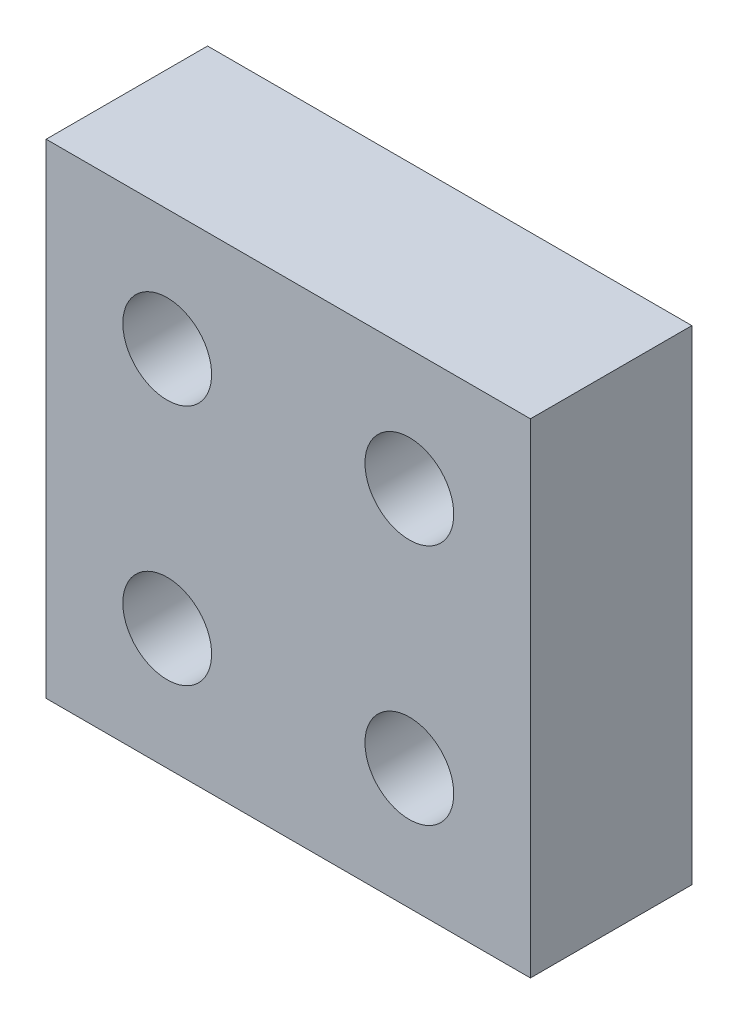
ISO-10303-21;
HEADER;
FILE_DESCRIPTION(('STEP AP214'),'2;1');
FILE_NAME('part.step','',(''),(''),'','','');
FILE_SCHEMA(('AUTOMOTIVE_DESIGN { 1 0 10303 214 1 1 1 1 }'));
ENDSEC;
DATA;
#1=APPLICATION_CONTEXT('core data for automotive mechanical design processes');
#2=APPLICATION_PROTOCOL_DEFINITION('international standard','automotive_design',2000,#1);
#3=PRODUCT_CONTEXT('',#1,'mechanical');
#4=PRODUCT('Part','Part','',(#3));
#5=PRODUCT_RELATED_PRODUCT_CATEGORY('part','',(#4));
#6=PRODUCT_DEFINITION_FORMATION('','',#4);
#7=PRODUCT_DEFINITION_CONTEXT('part definition',#1,'design');
#8=PRODUCT_DEFINITION('design','',#6,#7);
#9=PRODUCT_DEFINITION_SHAPE('','',#8);
#10=(LENGTH_UNIT() NAMED_UNIT(*) SI_UNIT(.MILLI.,.METRE.));
#11=(NAMED_UNIT(*) PLANE_ANGLE_UNIT() SI_UNIT($,.RADIAN.));
#12=(NAMED_UNIT(*) SI_UNIT($,.STERADIAN.) SOLID_ANGLE_UNIT());
#13=UNCERTAINTY_MEASURE_WITH_UNIT(LENGTH_MEASURE(1.E-05),#10,'distance_accuracy_value','');
#14=(GEOMETRIC_REPRESENTATION_CONTEXT(3) GLOBAL_UNCERTAINTY_ASSIGNED_CONTEXT((#13)) GLOBAL_UNIT_ASSIGNED_CONTEXT((#10,
#11,#12)) REPRESENTATION_CONTEXT('',''));
#15=CARTESIAN_POINT('',(0.,0.,0.));
#16=DIRECTION('',(0.,0.,1.));
#17=DIRECTION('',(1.,0.,0.));
#18=AXIS2_PLACEMENT_3D('',#15,#16,#17);
#19=CARTESIAN_POINT('',(12.,12.,0.));
#20=DIRECTION('',(0.,1.,0.));
#21=DIRECTION('',(-1.,0.,0.));
#22=AXIS2_PLACEMENT_3D('',#19,#20,#21);
#23=PLANE('',#22);
#24=DIRECTION('',(-1.,0.,0.));
#25=VECTOR('',#24,1.);
#26=CARTESIAN_POINT('',(12.,12.,8.));
#27=LINE('',#26,#25);
#28=CARTESIAN_POINT('',(12.,12.,8.));
#29=VERTEX_POINT('',#28);
#30=CARTESIAN_POINT('',(-12.,12.,8.));
#31=VERTEX_POINT('',#30);
#32=EDGE_CURVE('E95',#29,#31,#27,.T.);
#33=ORIENTED_EDGE('',*,*,#32,.F.);
#34=DIRECTION('',(0.,0.,1.));
#35=VECTOR('',#34,1.);
#36=CARTESIAN_POINT('',(12.,12.,0.));
#37=LINE('',#36,#35);
#38=CARTESIAN_POINT('',(12.,12.,0.));
#39=VERTEX_POINT('',#38);
#40=EDGE_CURVE('E11',#39,#29,#37,.T.);
#41=ORIENTED_EDGE('',*,*,#40,.F.);
#42=DIRECTION('',(-1.,0.,0.));
#43=VECTOR('',#42,1.);
#44=CARTESIAN_POINT('',(12.,12.,0.));
#45=LINE('',#44,#43);
#46=CARTESIAN_POINT('',(-12.,12.,0.));
#47=VERTEX_POINT('',#46);
#48=EDGE_CURVE('E88',#39,#47,#45,.T.);
#49=ORIENTED_EDGE('',*,*,#48,.T.);
#50=DIRECTION('',(0.,0.,1.));
#51=VECTOR('',#50,1.);
#52=CARTESIAN_POINT('',(-12.,12.,0.));
#53=LINE('',#52,#51);
#54=EDGE_CURVE('E33',#47,#31,#53,.T.);
#55=ORIENTED_EDGE('',*,*,#54,.T.);
#56=EDGE_LOOP('',(#33,#41,#49,#55));
#57=FACE_BOUND('',#56,.T.);
#58=ADVANCED_FACE('F30',(#57),#23,.T.);
#59=CARTESIAN_POINT('',(12.,-12.,0.));
#60=DIRECTION('',(1.,0.,0.));
#61=DIRECTION('',(0.,1.,0.));
#62=AXIS2_PLACEMENT_3D('',#59,#60,#61);
#63=PLANE('',#62);
#64=DIRECTION('',(0.,1.,0.));
#65=VECTOR('',#64,1.);
#66=CARTESIAN_POINT('',(12.,-12.,8.));
#67=LINE('',#66,#65);
#68=CARTESIAN_POINT('',(12.,-12.,8.));
#69=VERTEX_POINT('',#68);
#70=EDGE_CURVE('E90',#69,#29,#67,.T.);
#71=ORIENTED_EDGE('',*,*,#70,.F.);
#72=DIRECTION('',(0.,0.,1.));
#73=VECTOR('',#72,1.);
#74=CARTESIAN_POINT('',(12.,-12.,0.));
#75=LINE('',#74,#73);
#76=CARTESIAN_POINT('',(12.,-12.,0.));
#77=VERTEX_POINT('',#76);
#78=EDGE_CURVE('E39',#77,#69,#75,.T.);
#79=ORIENTED_EDGE('',*,*,#78,.F.);
#80=DIRECTION('',(0.,1.,0.));
#81=VECTOR('',#80,1.);
#82=CARTESIAN_POINT('',(12.,-12.,0.));
#83=LINE('',#82,#81);
#84=EDGE_CURVE('E85',#77,#39,#83,.T.);
#85=ORIENTED_EDGE('',*,*,#84,.T.);
#86=ORIENTED_EDGE('',*,*,#40,.T.);
#87=EDGE_LOOP('',(#71,#79,#85,#86));
#88=FACE_BOUND('',#87,.T.);
#89=ADVANCED_FACE('F106',(#88),#63,.T.);
#90=CARTESIAN_POINT('',(-12.,-12.,0.));
#91=DIRECTION('',(0.,-1.,0.));
#92=DIRECTION('',(0.,0.,-1.));
#93=AXIS2_PLACEMENT_3D('',#90,#91,#92);
#94=PLANE('',#93);
#95=DIRECTION('',(1.,0.,0.));
#96=VECTOR('',#95,1.);
#97=CARTESIAN_POINT('',(-12.,-12.,8.));
#98=LINE('',#97,#96);
#99=CARTESIAN_POINT('',(-12.,-12.,8.));
#100=VERTEX_POINT('',#99);
#101=EDGE_CURVE('E80',#100,#69,#98,.T.);
#102=ORIENTED_EDGE('',*,*,#101,.F.);
#103=DIRECTION('',(0.,0.,1.));
#104=VECTOR('',#103,1.);
#105=CARTESIAN_POINT('',(-12.,-12.,0.));
#106=LINE('',#105,#104);
#107=CARTESIAN_POINT('',(-12.,-12.,0.));
#108=VERTEX_POINT('',#107);
#109=EDGE_CURVE('E75',#108,#100,#106,.T.);
#110=ORIENTED_EDGE('',*,*,#109,.F.);
#111=DIRECTION('',(1.,0.,0.));
#112=VECTOR('',#111,1.);
#113=CARTESIAN_POINT('',(-12.,-12.,0.));
#114=LINE('',#113,#112);
#115=EDGE_CURVE('E78',#108,#77,#114,.T.);
#116=ORIENTED_EDGE('',*,*,#115,.T.);
#117=ORIENTED_EDGE('',*,*,#78,.T.);
#118=EDGE_LOOP('',(#102,#110,#116,#117));
#119=FACE_BOUND('',#118,.T.);
#120=ADVANCED_FACE('F77',(#119),#94,.T.);
#121=CARTESIAN_POINT('',(-12.,12.,0.));
#122=DIRECTION('',(-1.,0.,0.));
#123=DIRECTION('',(0.,-1.,0.));
#124=AXIS2_PLACEMENT_3D('',#121,#122,#123);
#125=PLANE('',#124);
#126=DIRECTION('',(0.,-1.,0.));
#127=VECTOR('',#126,1.);
#128=CARTESIAN_POINT('',(-12.,12.,8.));
#129=LINE('',#128,#127);
#130=EDGE_CURVE('E98',#31,#100,#129,.T.);
#131=ORIENTED_EDGE('',*,*,#130,.F.);
#132=ORIENTED_EDGE('',*,*,#54,.F.);
#133=DIRECTION('',(0.,-1.,0.));
#134=VECTOR('',#133,1.);
#135=CARTESIAN_POINT('',(-12.,12.,0.));
#136=LINE('',#135,#134);
#137=EDGE_CURVE('E84',#47,#108,#136,.T.);
#138=ORIENTED_EDGE('',*,*,#137,.T.);
#139=ORIENTED_EDGE('',*,*,#109,.T.);
#140=EDGE_LOOP('',(#131,#132,#138,#139));
#141=FACE_BOUND('',#140,.T.);
#142=ADVANCED_FACE('F87',(#141),#125,.T.);
#143=CARTESIAN_POINT('',(-12.,12.,0.));
#144=DIRECTION('',(0.,0.,1.));
#145=DIRECTION('',(1.,0.,0.));
#146=AXIS2_PLACEMENT_3D('',#143,#144,#145);
#147=PLANE('',#146);
#148=CARTESIAN_POINT('',(-6.,5.99999999999998,0.));
#149=DIRECTION('',(0.,0.,1.));
#150=DIRECTION('',(-1.,0.,0.));
#151=AXIS2_PLACEMENT_3D('',#148,#149,#150);
#152=CIRCLE('',#151,2.2);
#153=CARTESIAN_POINT('',(-8.2,5.99999999999998,0.));
#154=VERTEX_POINT('',#153);
#155=EDGE_CURVE('E147',#154,#154,#152,.T.);
#156=ORIENTED_EDGE('',*,*,#155,.T.);
#157=EDGE_LOOP('',(#156));
#158=FACE_BOUND('',#157,.T.);
#159=CARTESIAN_POINT('',(6.00000000000001,-6.00000000000002,0.));
#160=DIRECTION('',(0.,0.,1.));
#161=DIRECTION('',(-1.,0.,0.));
#162=AXIS2_PLACEMENT_3D('',#159,#160,#161);
#163=CIRCLE('',#162,2.2);
#164=CARTESIAN_POINT('',(3.80000000000001,-6.00000000000002,0.));
#165=VERTEX_POINT('',#164);
#166=EDGE_CURVE('E155',#165,#165,#163,.T.);
#167=ORIENTED_EDGE('',*,*,#166,.T.);
#168=EDGE_LOOP('',(#167));
#169=FACE_BOUND('',#168,.T.);
#170=CARTESIAN_POINT('',(6.00000000000001,5.99999999999998,0.));
#171=DIRECTION('',(0.,0.,1.));
#172=DIRECTION('',(-1.,0.,0.));
#173=AXIS2_PLACEMENT_3D('',#170,#171,#172);
#174=CIRCLE('',#173,2.2);
#175=CARTESIAN_POINT('',(3.80000000000001,5.99999999999998,0.));
#176=VERTEX_POINT('',#175);
#177=EDGE_CURVE('E161',#176,#176,#174,.T.);
#178=ORIENTED_EDGE('',*,*,#177,.T.);
#179=EDGE_LOOP('',(#178));
#180=FACE_BOUND('',#179,.T.);
#181=CARTESIAN_POINT('',(-5.99999999999997,-6.00000000000002,0.));
#182=DIRECTION('',(0.,0.,1.));
#183=DIRECTION('',(-1.,0.,0.));
#184=AXIS2_PLACEMENT_3D('',#181,#182,#183);
#185=CIRCLE('',#184,2.2);
#186=CARTESIAN_POINT('',(-8.19999999999997,-6.00000000000002,0.));
#187=VERTEX_POINT('',#186);
#188=EDGE_CURVE('E99',#187,#187,#185,.T.);
#189=ORIENTED_EDGE('',*,*,#188,.T.);
#190=EDGE_LOOP('',(#189));
#191=FACE_BOUND('',#190,.T.);
#192=ORIENTED_EDGE('',*,*,#48,.F.);
#193=ORIENTED_EDGE('',*,*,#84,.F.);
#194=ORIENTED_EDGE('',*,*,#115,.F.);
#195=ORIENTED_EDGE('',*,*,#137,.F.);
#196=EDGE_LOOP('',(#192,#193,#194,#195));
#197=FACE_BOUND('',#196,.T.);
#198=ADVANCED_FACE('F83',(#158,#169,#180,#191,#197),#147,.F.);
#199=CARTESIAN_POINT('',(-12.,12.,8.));
#200=DIRECTION('',(0.,0.,1.));
#201=DIRECTION('',(1.,0.,0.));
#202=AXIS2_PLACEMENT_3D('',#199,#200,#201);
#203=PLANE('',#202);
#204=CARTESIAN_POINT('',(-6.,5.99999999999998,8.));
#205=DIRECTION('',(0.,0.,1.));
#206=DIRECTION('',(-1.,0.,0.));
#207=AXIS2_PLACEMENT_3D('',#204,#205,#206);
#208=CIRCLE('',#207,2.2);
#209=CARTESIAN_POINT('',(-8.2,5.99999999999998,8.));
#210=VERTEX_POINT('',#209);
#211=EDGE_CURVE('E150',#210,#210,#208,.T.);
#212=ORIENTED_EDGE('',*,*,#211,.F.);
#213=EDGE_LOOP('',(#212));
#214=FACE_BOUND('',#213,.T.);
#215=CARTESIAN_POINT('',(6.00000000000001,-6.00000000000002,8.));
#216=DIRECTION('',(0.,0.,1.));
#217=DIRECTION('',(-1.,0.,0.));
#218=AXIS2_PLACEMENT_3D('',#215,#216,#217);
#219=CIRCLE('',#218,2.2);
#220=CARTESIAN_POINT('',(3.80000000000001,-6.00000000000002,8.));
#221=VERTEX_POINT('',#220);
#222=EDGE_CURVE('E152',#221,#221,#219,.T.);
#223=ORIENTED_EDGE('',*,*,#222,.F.);
#224=EDGE_LOOP('',(#223));
#225=FACE_BOUND('',#224,.T.);
#226=CARTESIAN_POINT('',(6.00000000000001,5.99999999999998,8.));
#227=DIRECTION('',(0.,0.,1.));
#228=DIRECTION('',(-1.,0.,0.));
#229=AXIS2_PLACEMENT_3D('',#226,#227,#228);
#230=CIRCLE('',#229,2.2);
#231=CARTESIAN_POINT('',(3.80000000000001,5.99999999999998,8.));
#232=VERTEX_POINT('',#231);
#233=EDGE_CURVE('E158',#232,#232,#230,.T.);
#234=ORIENTED_EDGE('',*,*,#233,.F.);
#235=EDGE_LOOP('',(#234));
#236=FACE_BOUND('',#235,.T.);
#237=CARTESIAN_POINT('',(-5.99999999999997,-6.00000000000002,8.));
#238=DIRECTION('',(0.,0.,1.));
#239=DIRECTION('',(-1.,0.,0.));
#240=AXIS2_PLACEMENT_3D('',#237,#238,#239);
#241=CIRCLE('',#240,2.2);
#242=CARTESIAN_POINT('',(-8.19999999999997,-6.00000000000002,8.));
#243=VERTEX_POINT('',#242);
#244=EDGE_CURVE('E164',#243,#243,#241,.T.);
#245=ORIENTED_EDGE('',*,*,#244,.F.);
#246=EDGE_LOOP('',(#245));
#247=FACE_BOUND('',#246,.T.);
#248=ORIENTED_EDGE('',*,*,#32,.T.);
#249=ORIENTED_EDGE('',*,*,#130,.T.);
#250=ORIENTED_EDGE('',*,*,#101,.T.);
#251=ORIENTED_EDGE('',*,*,#70,.T.);
#252=EDGE_LOOP('',(#248,#249,#250,#251));
#253=FACE_BOUND('',#252,.T.);
#254=ADVANCED_FACE('F105',(#214,#225,#236,#247,#253),#203,.T.);
#255=CARTESIAN_POINT('',(-5.99999999999997,-6.00000000000002,0.));
#256=DIRECTION('',(0.,0.,1.));
#257=DIRECTION('',(1.,0.,0.));
#258=AXIS2_PLACEMENT_3D('',#255,#256,#257);
#259=CYLINDRICAL_SURFACE('',#258,2.2);
#260=ORIENTED_EDGE('',*,*,#188,.F.);
#261=EDGE_LOOP('',(#260));
#262=FACE_BOUND('',#261,.T.);
#263=ORIENTED_EDGE('',*,*,#244,.T.);
#264=EDGE_LOOP('',(#263));
#265=FACE_BOUND('',#264,.T.);
#266=ADVANCED_FACE('F124',(#262,#265),#259,.F.);
#267=CARTESIAN_POINT('',(6.00000000000001,5.99999999999998,0.));
#268=DIRECTION('',(0.,0.,1.));
#269=DIRECTION('',(1.,0.,0.));
#270=AXIS2_PLACEMENT_3D('',#267,#268,#269);
#271=CYLINDRICAL_SURFACE('',#270,2.2);
#272=ORIENTED_EDGE('',*,*,#177,.F.);
#273=EDGE_LOOP('',(#272));
#274=FACE_BOUND('',#273,.T.);
#275=ORIENTED_EDGE('',*,*,#233,.T.);
#276=EDGE_LOOP('',(#275));
#277=FACE_BOUND('',#276,.T.);
#278=ADVANCED_FACE('F131',(#274,#277),#271,.F.);
#279=CARTESIAN_POINT('',(6.00000000000001,-6.00000000000002,0.));
#280=DIRECTION('',(0.,0.,1.));
#281=DIRECTION('',(1.,0.,0.));
#282=AXIS2_PLACEMENT_3D('',#279,#280,#281);
#283=CYLINDRICAL_SURFACE('',#282,2.2);
#284=ORIENTED_EDGE('',*,*,#166,.F.);
#285=EDGE_LOOP('',(#284));
#286=FACE_BOUND('',#285,.T.);
#287=ORIENTED_EDGE('',*,*,#222,.T.);
#288=EDGE_LOOP('',(#287));
#289=FACE_BOUND('',#288,.T.);
#290=ADVANCED_FACE('F135',(#286,#289),#283,.F.);
#291=CARTESIAN_POINT('',(-6.,5.99999999999998,0.));
#292=DIRECTION('',(0.,0.,1.));
#293=DIRECTION('',(1.,0.,0.));
#294=AXIS2_PLACEMENT_3D('',#291,#292,#293);
#295=CYLINDRICAL_SURFACE('',#294,2.2);
#296=ORIENTED_EDGE('',*,*,#155,.F.);
#297=EDGE_LOOP('',(#296));
#298=FACE_BOUND('',#297,.T.);
#299=ORIENTED_EDGE('',*,*,#211,.T.);
#300=EDGE_LOOP('',(#299));
#301=FACE_BOUND('',#300,.T.);
#302=ADVANCED_FACE('F139',(#298,#301),#295,.F.);
#303=CLOSED_SHELL('',(#58,#89,#120,#142,#198,#254,#266,#278,#290,#302));
#304=MANIFOLD_SOLID_BREP('B2',#303);
#305=ADVANCED_BREP_SHAPE_REPRESENTATION('',(#18,#304),#14);
#306=SHAPE_DEFINITION_REPRESENTATION(#9,#305);
ENDSEC;
END-ISO-10303-21;
